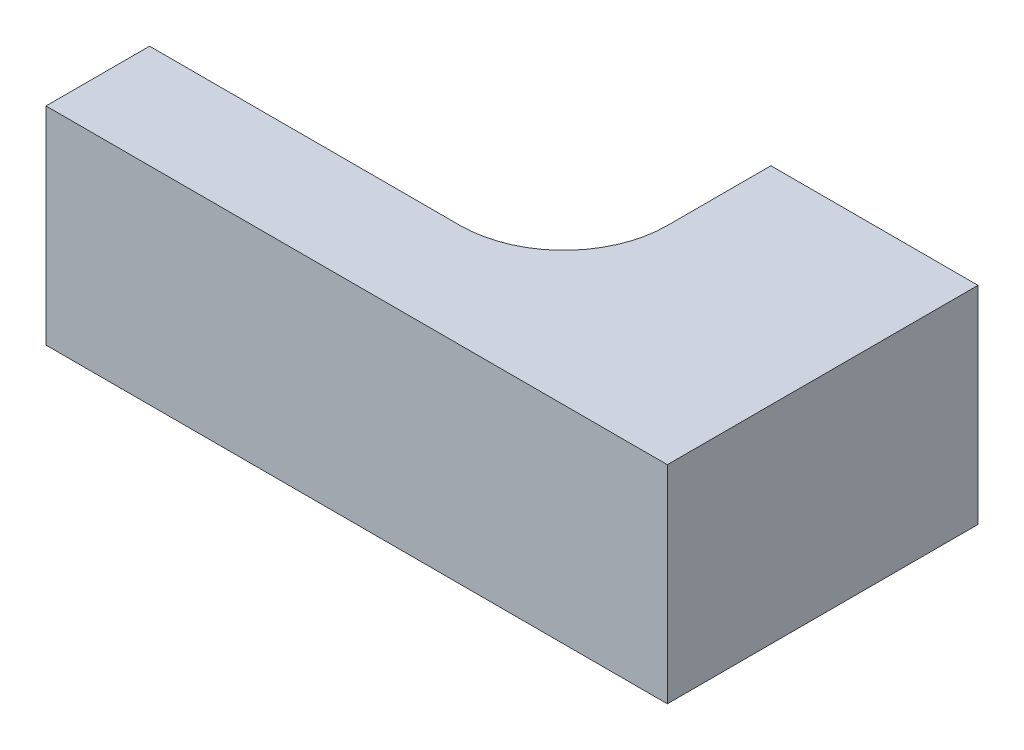
ISO-10303-21;
HEADER;
FILE_DESCRIPTION(('STEP AP214'),'2;1');
FILE_NAME('part.step','',(''),(''),'','','');
FILE_SCHEMA(('AUTOMOTIVE_DESIGN { 1 0 10303 214 1 1 1 1 }'));
ENDSEC;
DATA;
#1=APPLICATION_CONTEXT('core data for automotive mechanical design processes');
#2=APPLICATION_PROTOCOL_DEFINITION('international standard','automotive_design',2000,#1);
#3=PRODUCT_CONTEXT('',#1,'mechanical');
#4=PRODUCT('Part','Part','',(#3));
#5=PRODUCT_RELATED_PRODUCT_CATEGORY('part','',(#4));
#6=PRODUCT_DEFINITION_FORMATION('','',#4);
#7=PRODUCT_DEFINITION_CONTEXT('part definition',#1,'design');
#8=PRODUCT_DEFINITION('design','',#6,#7);
#9=PRODUCT_DEFINITION_SHAPE('','',#8);
#10=(LENGTH_UNIT() NAMED_UNIT(*) SI_UNIT(.MILLI.,.METRE.));
#11=(NAMED_UNIT(*) PLANE_ANGLE_UNIT() SI_UNIT($,.RADIAN.));
#12=(NAMED_UNIT(*) SI_UNIT($,.STERADIAN.) SOLID_ANGLE_UNIT());
#13=UNCERTAINTY_MEASURE_WITH_UNIT(LENGTH_MEASURE(1.E-05),#10,'distance_accuracy_value','');
#14=(GEOMETRIC_REPRESENTATION_CONTEXT(3) GLOBAL_UNCERTAINTY_ASSIGNED_CONTEXT((#13)) GLOBAL_UNIT_ASSIGNED_CONTEXT((#10,
#11,#12)) REPRESENTATION_CONTEXT('',''));
#15=CARTESIAN_POINT('',(0.,0.,0.));
#16=DIRECTION('',(0.,0.,1.));
#17=DIRECTION('',(1.,0.,0.));
#18=AXIS2_PLACEMENT_3D('',#15,#16,#17);
#19=CARTESIAN_POINT('',(-20.,20.,0.));
#20=DIRECTION('',(0.,0.,1.));
#21=DIRECTION('',(-1.,0.,0.));
#22=AXIS2_PLACEMENT_3D('',#19,#20,#21);
#23=PLANE('',#22);
#24=DIRECTION('',(1.,0.,0.));
#25=VECTOR('',#24,1.);
#26=CARTESIAN_POINT('',(-20.,0.,0.));
#27=LINE('',#26,#25);
#28=CARTESIAN_POINT('',(-40.,0.,0.));
#29=VERTEX_POINT('',#28);
#30=CARTESIAN_POINT('',(-20.,0.,0.));
#31=VERTEX_POINT('',#30);
#32=EDGE_CURVE('E134',#29,#31,#27,.T.);
#33=ORIENTED_EDGE('',*,*,#32,.F.);
#34=DIRECTION('',(0.,-1.,0.));
#35=VECTOR('',#34,1.);
#36=CARTESIAN_POINT('',(-40.,20.,0.));
#37=LINE('',#36,#35);
#38=CARTESIAN_POINT('',(-40.,20.,0.));
#39=VERTEX_POINT('',#38);
#40=EDGE_CURVE('E133',#39,#29,#37,.T.);
#41=ORIENTED_EDGE('',*,*,#40,.F.);
#42=DIRECTION('',(1.,0.,0.));
#43=VECTOR('',#42,1.);
#44=CARTESIAN_POINT('',(-20.,20.,0.));
#45=LINE('',#44,#43);
#46=CARTESIAN_POINT('',(-20.,20.,0.));
#47=VERTEX_POINT('',#46);
#48=EDGE_CURVE('E156',#39,#47,#45,.T.);
#49=ORIENTED_EDGE('',*,*,#48,.T.);
#50=DIRECTION('',(0.,-1.,0.));
#51=VECTOR('',#50,1.);
#52=CARTESIAN_POINT('',(-20.,20.,0.));
#53=LINE('',#52,#51);
#54=EDGE_CURVE('E11',#47,#31,#53,.T.);
#55=ORIENTED_EDGE('',*,*,#54,.T.);
#56=EDGE_LOOP('',(#33,#41,#49,#55));
#57=FACE_BOUND('',#56,.T.);
#58=ADVANCED_FACE('F38',(#57),#23,.F.);
#59=CARTESIAN_POINT('',(-20.,20.,30.));
#60=DIRECTION('',(-1.,0.,0.));
#61=DIRECTION('',(0.,0.,-1.));
#62=AXIS2_PLACEMENT_3D('',#59,#60,#61);
#63=PLANE('',#62);
#64=DIRECTION('',(0.,0.,1.));
#65=VECTOR('',#64,1.);
#66=CARTESIAN_POINT('',(-20.,0.,30.));
#67=LINE('',#66,#65);
#68=CARTESIAN_POINT('',(-20.,0.,30.));
#69=VERTEX_POINT('',#68);
#70=EDGE_CURVE('E137',#31,#69,#67,.T.);
#71=ORIENTED_EDGE('',*,*,#70,.F.);
#72=ORIENTED_EDGE('',*,*,#54,.F.);
#73=DIRECTION('',(0.,0.,1.));
#74=VECTOR('',#73,1.);
#75=CARTESIAN_POINT('',(-20.,20.,30.));
#76=LINE('',#75,#74);
#77=CARTESIAN_POINT('',(-20.,20.,30.));
#78=VERTEX_POINT('',#77);
#79=EDGE_CURVE('E90',#47,#78,#76,.T.);
#80=ORIENTED_EDGE('',*,*,#79,.T.);
#81=DIRECTION('',(0.,-1.,0.));
#82=VECTOR('',#81,1.);
#83=CARTESIAN_POINT('',(-20.,20.,30.));
#84=LINE('',#83,#82);
#85=EDGE_CURVE('E47',#78,#69,#84,.T.);
#86=ORIENTED_EDGE('',*,*,#85,.T.);
#87=EDGE_LOOP('',(#71,#72,#80,#86));
#88=FACE_BOUND('',#87,.T.);
#89=ADVANCED_FACE('F170',(#88),#63,.F.);
#90=CARTESIAN_POINT('',(-80.,20.,30.));
#91=DIRECTION('',(0.,0.,-1.));
#92=DIRECTION('',(1.,0.,0.));
#93=AXIS2_PLACEMENT_3D('',#90,#91,#92);
#94=PLANE('',#93);
#95=DIRECTION('',(-1.,0.,0.));
#96=VECTOR('',#95,1.);
#97=CARTESIAN_POINT('',(-80.,0.,30.));
#98=LINE('',#97,#96);
#99=CARTESIAN_POINT('',(-80.,0.,30.));
#100=VERTEX_POINT('',#99);
#101=EDGE_CURVE('E141',#69,#100,#98,.T.);
#102=ORIENTED_EDGE('',*,*,#101,.F.);
#103=ORIENTED_EDGE('',*,*,#85,.F.);
#104=DIRECTION('',(-1.,0.,0.));
#105=VECTOR('',#104,1.);
#106=CARTESIAN_POINT('',(-80.,20.,30.));
#107=LINE('',#106,#105);
#108=CARTESIAN_POINT('',(-80.,20.,30.));
#109=VERTEX_POINT('',#108);
#110=EDGE_CURVE('E127',#78,#109,#107,.T.);
#111=ORIENTED_EDGE('',*,*,#110,.T.);
#112=DIRECTION('',(0.,-1.,0.));
#113=VECTOR('',#112,1.);
#114=CARTESIAN_POINT('',(-80.,20.,30.));
#115=LINE('',#114,#113);
#116=EDGE_CURVE('E163',#109,#100,#115,.T.);
#117=ORIENTED_EDGE('',*,*,#116,.T.);
#118=EDGE_LOOP('',(#102,#103,#111,#117));
#119=FACE_BOUND('',#118,.T.);
#120=ADVANCED_FACE('F183',(#119),#94,.F.);
#121=CARTESIAN_POINT('',(-80.,20.,20.));
#122=DIRECTION('',(1.,0.,0.));
#123=DIRECTION('',(0.,0.,1.));
#124=AXIS2_PLACEMENT_3D('',#121,#122,#123);
#125=PLANE('',#124);
#126=DIRECTION('',(0.,0.,-1.));
#127=VECTOR('',#126,1.);
#128=CARTESIAN_POINT('',(-80.,0.,20.));
#129=LINE('',#128,#127);
#130=CARTESIAN_POINT('',(-80.,0.,20.));
#131=VERTEX_POINT('',#130);
#132=EDGE_CURVE('E145',#100,#131,#129,.T.);
#133=ORIENTED_EDGE('',*,*,#132,.F.);
#134=ORIENTED_EDGE('',*,*,#116,.F.);
#135=DIRECTION('',(0.,0.,-1.));
#136=VECTOR('',#135,1.);
#137=CARTESIAN_POINT('',(-80.,20.,20.));
#138=LINE('',#137,#136);
#139=CARTESIAN_POINT('',(-80.,20.,20.));
#140=VERTEX_POINT('',#139);
#141=EDGE_CURVE('E124',#109,#140,#138,.T.);
#142=ORIENTED_EDGE('',*,*,#141,.T.);
#143=DIRECTION('',(0.,-1.,0.));
#144=VECTOR('',#143,1.);
#145=CARTESIAN_POINT('',(-80.,20.,20.));
#146=LINE('',#145,#144);
#147=EDGE_CURVE('E117',#140,#131,#146,.T.);
#148=ORIENTED_EDGE('',*,*,#147,.T.);
#149=EDGE_LOOP('',(#133,#134,#142,#148));
#150=FACE_BOUND('',#149,.T.);
#151=ADVANCED_FACE('F186',(#150),#125,.F.);
#152=CARTESIAN_POINT('',(-50.,20.,20.));
#153=DIRECTION('',(0.,0.,1.));
#154=DIRECTION('',(-1.,0.,0.));
#155=AXIS2_PLACEMENT_3D('',#152,#153,#154);
#156=PLANE('',#155);
#157=DIRECTION('',(1.,0.,0.));
#158=VECTOR('',#157,1.);
#159=CARTESIAN_POINT('',(-50.,0.,20.));
#160=LINE('',#159,#158);
#161=CARTESIAN_POINT('',(-50.,0.,20.));
#162=VERTEX_POINT('',#161);
#163=EDGE_CURVE('E149',#131,#162,#160,.T.);
#164=ORIENTED_EDGE('',*,*,#163,.F.);
#165=ORIENTED_EDGE('',*,*,#147,.F.);
#166=DIRECTION('',(1.,0.,0.));
#167=VECTOR('',#166,1.);
#168=CARTESIAN_POINT('',(-50.,20.,20.));
#169=LINE('',#168,#167);
#170=CARTESIAN_POINT('',(-50.,20.,20.));
#171=VERTEX_POINT('',#170);
#172=EDGE_CURVE('E105',#140,#171,#169,.T.);
#173=ORIENTED_EDGE('',*,*,#172,.T.);
#174=DIRECTION('',(0.,-1.,0.));
#175=VECTOR('',#174,1.);
#176=CARTESIAN_POINT('',(-50.,20.,20.));
#177=LINE('',#176,#175);
#178=EDGE_CURVE('E111',#171,#162,#177,.T.);
#179=ORIENTED_EDGE('',*,*,#178,.T.);
#180=EDGE_LOOP('',(#164,#165,#173,#179));
#181=FACE_BOUND('',#180,.T.);
#182=ADVANCED_FACE('F120',(#181),#156,.F.);
#183=CARTESIAN_POINT('',(-50.,20.,10.));
#184=DIRECTION('',(0.,-1.,0.));
#185=DIRECTION('',(0.,0.,-1.));
#186=AXIS2_PLACEMENT_3D('',#183,#184,#185);
#187=CYLINDRICAL_SURFACE('',#186,10.);
#188=CARTESIAN_POINT('',(-50.,0.,10.));
#189=DIRECTION('',(0.,1.,0.));
#190=DIRECTION('',(0.,0.,1.));
#191=AXIS2_PLACEMENT_3D('',#188,#189,#190);
#192=CIRCLE('',#191,10.);
#193=CARTESIAN_POINT('',(-40.,0.,10.));
#194=VERTEX_POINT('',#193);
#195=EDGE_CURVE('E113',#162,#194,#192,.T.);
#196=ORIENTED_EDGE('',*,*,#195,.F.);
#197=ORIENTED_EDGE('',*,*,#178,.F.);
#198=CARTESIAN_POINT('',(-50.,20.,10.));
#199=DIRECTION('',(0.,1.,0.));
#200=DIRECTION('',(0.,0.,1.));
#201=AXIS2_PLACEMENT_3D('',#198,#199,#200);
#202=CIRCLE('',#201,10.);
#203=CARTESIAN_POINT('',(-40.,20.,10.));
#204=VERTEX_POINT('',#203);
#205=EDGE_CURVE('E101',#171,#204,#202,.T.);
#206=ORIENTED_EDGE('',*,*,#205,.T.);
#207=DIRECTION('',(0.,-1.,0.));
#208=VECTOR('',#207,1.);
#209=CARTESIAN_POINT('',(-40.,20.,10.));
#210=LINE('',#209,#208);
#211=EDGE_CURVE('E118',#204,#194,#210,.T.);
#212=ORIENTED_EDGE('',*,*,#211,.T.);
#213=EDGE_LOOP('',(#196,#197,#206,#212));
#214=FACE_BOUND('',#213,.T.);
#215=ADVANCED_FACE('F112',(#214),#187,.F.);
#216=CARTESIAN_POINT('',(-40.,20.,0.));
#217=DIRECTION('',(1.,0.,0.));
#218=DIRECTION('',(0.,0.,1.));
#219=AXIS2_PLACEMENT_3D('',#216,#217,#218);
#220=PLANE('',#219);
#221=DIRECTION('',(0.,0.,-1.));
#222=VECTOR('',#221,1.);
#223=CARTESIAN_POINT('',(-40.,0.,0.));
#224=LINE('',#223,#222);
#225=EDGE_CURVE('E78',#194,#29,#224,.T.);
#226=ORIENTED_EDGE('',*,*,#225,.F.);
#227=ORIENTED_EDGE('',*,*,#211,.F.);
#228=DIRECTION('',(0.,0.,-1.));
#229=VECTOR('',#228,1.);
#230=CARTESIAN_POINT('',(-40.,20.,0.));
#231=LINE('',#230,#229);
#232=EDGE_CURVE('E55',#204,#39,#231,.T.);
#233=ORIENTED_EDGE('',*,*,#232,.T.);
#234=ORIENTED_EDGE('',*,*,#40,.T.);
#235=EDGE_LOOP('',(#226,#227,#233,#234));
#236=FACE_BOUND('',#235,.T.);
#237=ADVANCED_FACE('F226',(#236),#220,.F.);
#238=CARTESIAN_POINT('',(-50.,20.,10.));
#239=DIRECTION('',(0.,1.,0.));
#240=DIRECTION('',(0.,0.,1.));
#241=AXIS2_PLACEMENT_3D('',#238,#239,#240);
#242=PLANE('',#241);
#243=ORIENTED_EDGE('',*,*,#48,.F.);
#244=ORIENTED_EDGE('',*,*,#232,.F.);
#245=ORIENTED_EDGE('',*,*,#205,.F.);
#246=ORIENTED_EDGE('',*,*,#172,.F.);
#247=ORIENTED_EDGE('',*,*,#141,.F.);
#248=ORIENTED_EDGE('',*,*,#110,.F.);
#249=ORIENTED_EDGE('',*,*,#79,.F.);
#250=EDGE_LOOP('',(#243,#244,#245,#246,#247,#248,#249));
#251=FACE_BOUND('',#250,.T.);
#252=ADVANCED_FACE('F103',(#251),#242,.T.);
#253=CARTESIAN_POINT('',(-50.,0.,10.));
#254=DIRECTION('',(0.,1.,0.));
#255=DIRECTION('',(0.,0.,1.));
#256=AXIS2_PLACEMENT_3D('',#253,#254,#255);
#257=PLANE('',#256);
#258=ORIENTED_EDGE('',*,*,#32,.T.);
#259=ORIENTED_EDGE('',*,*,#70,.T.);
#260=ORIENTED_EDGE('',*,*,#101,.T.);
#261=ORIENTED_EDGE('',*,*,#132,.T.);
#262=ORIENTED_EDGE('',*,*,#163,.T.);
#263=ORIENTED_EDGE('',*,*,#195,.T.);
#264=ORIENTED_EDGE('',*,*,#225,.T.);
#265=EDGE_LOOP('',(#258,#259,#260,#261,#262,#263,#264));
#266=FACE_BOUND('',#265,.T.);
#267=ADVANCED_FACE('F173',(#266),#257,.F.);
#268=CLOSED_SHELL('',(#58,#89,#120,#151,#182,#215,#237,#252,#267));
#269=MANIFOLD_SOLID_BREP('B2',#268);
#270=ADVANCED_BREP_SHAPE_REPRESENTATION('',(#18,#269),#14);
#271=SHAPE_DEFINITION_REPRESENTATION(#9,#270);
ENDSEC;
END-ISO-10303-21;
